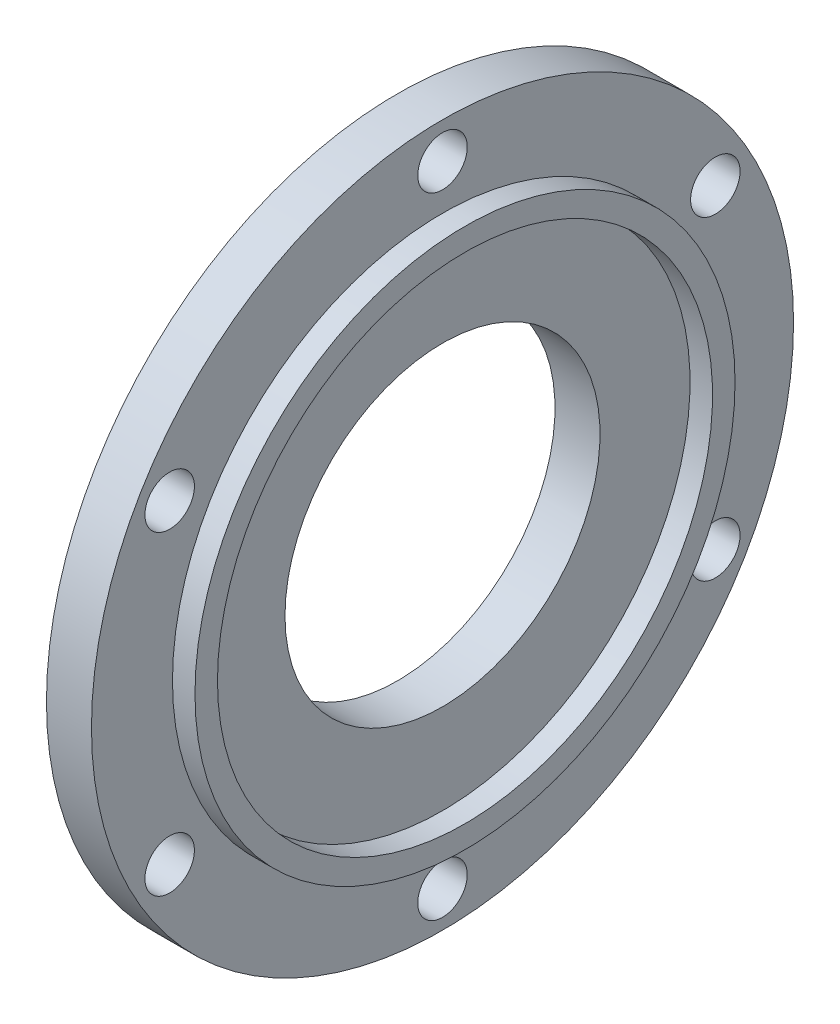
ISO-10303-21;
HEADER;
FILE_DESCRIPTION(('STEP AP214'),'2;1');
FILE_NAME('part.step','',(''),(''),'','','');
FILE_SCHEMA(('AUTOMOTIVE_DESIGN { 1 0 10303 214 1 1 1 1 }'));
ENDSEC;
DATA;
#1=APPLICATION_CONTEXT('core data for automotive mechanical design processes');
#2=APPLICATION_PROTOCOL_DEFINITION('international standard','automotive_design',2000,#1);
#3=PRODUCT_CONTEXT('',#1,'mechanical');
#4=PRODUCT('Part','Part','',(#3));
#5=PRODUCT_RELATED_PRODUCT_CATEGORY('part','',(#4));
#6=PRODUCT_DEFINITION_FORMATION('','',#4);
#7=PRODUCT_DEFINITION_CONTEXT('part definition',#1,'design');
#8=PRODUCT_DEFINITION('design','',#6,#7);
#9=PRODUCT_DEFINITION_SHAPE('','',#8);
#10=(LENGTH_UNIT() NAMED_UNIT(*) SI_UNIT(.MILLI.,.METRE.));
#11=(NAMED_UNIT(*) PLANE_ANGLE_UNIT() SI_UNIT($,.RADIAN.));
#12=(NAMED_UNIT(*) SI_UNIT($,.STERADIAN.) SOLID_ANGLE_UNIT());
#13=UNCERTAINTY_MEASURE_WITH_UNIT(LENGTH_MEASURE(1.E-05),#10,'distance_accuracy_value','');
#14=(GEOMETRIC_REPRESENTATION_CONTEXT(3) GLOBAL_UNCERTAINTY_ASSIGNED_CONTEXT((#13)) GLOBAL_UNIT_ASSIGNED_CONTEXT((#10,
#11,#12)) REPRESENTATION_CONTEXT('',''));
#15=CARTESIAN_POINT('',(0.,0.,0.));
#16=DIRECTION('',(0.,0.,1.));
#17=DIRECTION('',(1.,0.,0.));
#18=AXIS2_PLACEMENT_3D('',#15,#16,#17);
#19=CARTESIAN_POINT('',(0.,0.,0.));
#20=DIRECTION('',(-1.,0.,0.));
#21=DIRECTION('',(0.,0.,1.));
#22=AXIS2_PLACEMENT_3D('',#19,#20,#21);
#23=CYLINDRICAL_SURFACE('',#22,78.);
#24=CARTESIAN_POINT('',(0.,0.,0.));
#25=DIRECTION('',(-1.,0.,0.));
#26=DIRECTION('',(0.,0.,1.));
#27=AXIS2_PLACEMENT_3D('',#24,#25,#26);
#28=CIRCLE('',#27,78.);
#29=CARTESIAN_POINT('',(0.,0.,78.));
#30=VERTEX_POINT('',#29);
#31=EDGE_CURVE('E10',#30,#30,#28,.T.);
#32=ORIENTED_EDGE('',*,*,#31,.F.);
#33=EDGE_LOOP('',(#32));
#34=FACE_BOUND('',#33,.T.);
#35=CARTESIAN_POINT('',(10.,0.,0.));
#36=DIRECTION('',(-1.,0.,0.));
#37=DIRECTION('',(0.,0.,1.));
#38=AXIS2_PLACEMENT_3D('',#35,#36,#37);
#39=CIRCLE('',#38,78.);
#40=CARTESIAN_POINT('',(10.,0.,78.));
#41=VERTEX_POINT('',#40);
#42=EDGE_CURVE('E74',#41,#41,#39,.T.);
#43=ORIENTED_EDGE('',*,*,#42,.T.);
#44=EDGE_LOOP('',(#43));
#45=FACE_BOUND('',#44,.T.);
#46=ADVANCED_FACE('F39',(#34,#45),#23,.T.);
#47=CARTESIAN_POINT('',(0.,78.,0.));
#48=DIRECTION('',(1.,0.,0.));
#49=DIRECTION('',(0.,0.,-1.));
#50=AXIS2_PLACEMENT_3D('',#47,#48,#49);
#51=PLANE('',#50);
#52=CARTESIAN_POINT('',(0.,70.,2.56739074444567E-13));
#53=DIRECTION('',(1.,0.,0.));
#54=DIRECTION('',(0.,0.86602540378444,-0.499999999999998));
#55=AXIS2_PLACEMENT_3D('',#52,#53,#54);
#56=CIRCLE('',#55,5.5);
#57=CARTESIAN_POINT('',(0.,74.7631397208144,-2.74999999999973));
#58=VERTEX_POINT('',#57);
#59=EDGE_CURVE('E83',#58,#58,#56,.T.);
#60=ORIENTED_EDGE('',*,*,#59,.T.);
#61=EDGE_LOOP('',(#60));
#62=FACE_BOUND('',#61,.T.);
#63=CARTESIAN_POINT('',(0.,34.9999999999996,60.6217782649109));
#64=DIRECTION('',(1.,0.,0.));
#65=DIRECTION('',(0.,0.866025403784436,0.500000000000004));
#66=AXIS2_PLACEMENT_3D('',#63,#64,#65);
#67=CIRCLE('',#66,5.5);
#68=CARTESIAN_POINT('',(0.,39.7631397208141,63.371778264911));
#69=VERTEX_POINT('',#68);
#70=EDGE_CURVE('E115',#69,#69,#67,.T.);
#71=ORIENTED_EDGE('',*,*,#70,.T.);
#72=EDGE_LOOP('',(#71));
#73=FACE_BOUND('',#72,.T.);
#74=CARTESIAN_POINT('',(0.,-35.0000000000001,60.6217782649107));
#75=DIRECTION('',(1.,0.,0.));
#76=DIRECTION('',(0.,0.,1.));
#77=AXIS2_PLACEMENT_3D('',#74,#75,#76);
#78=CIRCLE('',#77,5.5);
#79=CARTESIAN_POINT('',(0.,-35.0000000000001,66.1217782649107));
#80=VERTEX_POINT('',#79);
#81=EDGE_CURVE('E107',#80,#80,#78,.T.);
#82=ORIENTED_EDGE('',*,*,#81,.T.);
#83=EDGE_LOOP('',(#82));
#84=FACE_BOUND('',#83,.T.);
#85=CARTESIAN_POINT('',(0.,-70.,-7.45931094670027E-13));
#86=DIRECTION('',(1.,0.,0.));
#87=DIRECTION('',(0.,-0.866025403784443,0.499999999999992));
#88=AXIS2_PLACEMENT_3D('',#85,#86,#87);
#89=CIRCLE('',#88,5.5);
#90=CARTESIAN_POINT('',(0.,-74.7631397208144,2.74999999999921));
#91=VERTEX_POINT('',#90);
#92=EDGE_CURVE('E99',#91,#91,#89,.T.);
#93=ORIENTED_EDGE('',*,*,#92,.T.);
#94=EDGE_LOOP('',(#93));
#95=FACE_BOUND('',#94,.T.);
#96=CARTESIAN_POINT('',(0.,-34.9999999999992,-60.6217782649112));
#97=DIRECTION('',(1.,0.,0.));
#98=DIRECTION('',(0.,-0.866025403784433,-0.50000000000001));
#99=AXIS2_PLACEMENT_3D('',#96,#97,#98);
#100=CIRCLE('',#99,5.5);
#101=CARTESIAN_POINT('',(0.,-39.7631397208136,-63.3717782649112));
#102=VERTEX_POINT('',#101);
#103=EDGE_CURVE('E91',#102,#102,#100,.T.);
#104=ORIENTED_EDGE('',*,*,#103,.T.);
#105=EDGE_LOOP('',(#104));
#106=FACE_BOUND('',#105,.T.);
#107=CARTESIAN_POINT('',(0.,35.0000000000001,-60.6217782649107));
#108=DIRECTION('',(1.,0.,0.));
#109=DIRECTION('',(0.,0.,-1.));
#110=AXIS2_PLACEMENT_3D('',#107,#108,#109);
#111=CIRCLE('',#110,5.5);
#112=CARTESIAN_POINT('',(0.,35.0000000000001,-66.1217782649107));
#113=VERTEX_POINT('',#112);
#114=EDGE_CURVE('E78',#113,#113,#111,.T.);
#115=ORIENTED_EDGE('',*,*,#114,.T.);
#116=EDGE_LOOP('',(#115));
#117=FACE_BOUND('',#116,.T.);
#118=CARTESIAN_POINT('',(0.,0.,0.));
#119=DIRECTION('',(-1.,0.,0.));
#120=DIRECTION('',(0.,0.,1.));
#121=AXIS2_PLACEMENT_3D('',#118,#119,#120);
#122=CIRCLE('',#121,35.);
#123=CARTESIAN_POINT('',(0.,0.,35.));
#124=VERTEX_POINT('',#123);
#125=EDGE_CURVE('E46',#124,#124,#122,.T.);
#126=ORIENTED_EDGE('',*,*,#125,.F.);
#127=EDGE_LOOP('',(#126));
#128=FACE_BOUND('',#127,.T.);
#129=ORIENTED_EDGE('',*,*,#31,.T.);
#130=EDGE_LOOP('',(#129));
#131=FACE_BOUND('',#130,.T.);
#132=ADVANCED_FACE('F127',(#62,#73,#84,#95,#106,#117,#128,#131),#51,.F.);
#133=CARTESIAN_POINT('',(0.,0.,0.));
#134=DIRECTION('',(-1.,0.,0.));
#135=DIRECTION('',(0.,0.,1.));
#136=AXIS2_PLACEMENT_3D('',#133,#134,#135);
#137=CYLINDRICAL_SURFACE('',#136,35.);
#138=CARTESIAN_POINT('',(10.,0.,0.));
#139=DIRECTION('',(-1.,0.,0.));
#140=DIRECTION('',(0.,0.,1.));
#141=AXIS2_PLACEMENT_3D('',#138,#139,#140);
#142=CIRCLE('',#141,35.);
#143=CARTESIAN_POINT('',(10.,0.,35.));
#144=VERTEX_POINT('',#143);
#145=EDGE_CURVE('E51',#144,#144,#142,.T.);
#146=ORIENTED_EDGE('',*,*,#145,.F.);
#147=EDGE_LOOP('',(#146));
#148=FACE_BOUND('',#147,.T.);
#149=ORIENTED_EDGE('',*,*,#125,.T.);
#150=EDGE_LOOP('',(#149));
#151=FACE_BOUND('',#150,.T.);
#152=ADVANCED_FACE('F177',(#148,#151),#137,.F.);
#153=CARTESIAN_POINT('',(10.,35.,0.));
#154=DIRECTION('',(-1.,0.,0.));
#155=DIRECTION('',(0.,0.,1.));
#156=AXIS2_PLACEMENT_3D('',#153,#154,#155);
#157=PLANE('',#156);
#158=CARTESIAN_POINT('',(10.,0.,0.));
#159=DIRECTION('',(-1.,0.,0.));
#160=DIRECTION('',(0.,0.,1.));
#161=AXIS2_PLACEMENT_3D('',#158,#159,#160);
#162=CIRCLE('',#161,55.);
#163=CARTESIAN_POINT('',(10.,0.,55.));
#164=VERTEX_POINT('',#163);
#165=EDGE_CURVE('E56',#164,#164,#162,.T.);
#166=ORIENTED_EDGE('',*,*,#165,.F.);
#167=EDGE_LOOP('',(#166));
#168=FACE_BOUND('',#167,.T.);
#169=ORIENTED_EDGE('',*,*,#145,.T.);
#170=EDGE_LOOP('',(#169));
#171=FACE_BOUND('',#170,.T.);
#172=ADVANCED_FACE('F171',(#168,#171),#157,.F.);
#173=CARTESIAN_POINT('',(0.,0.,0.));
#174=DIRECTION('',(-1.,0.,0.));
#175=DIRECTION('',(0.,0.,1.));
#176=AXIS2_PLACEMENT_3D('',#173,#174,#175);
#177=CYLINDRICAL_SURFACE('',#176,55.);
#178=CARTESIAN_POINT('',(15.,0.,0.));
#179=DIRECTION('',(-1.,0.,0.));
#180=DIRECTION('',(0.,0.,1.));
#181=AXIS2_PLACEMENT_3D('',#178,#179,#180);
#182=CIRCLE('',#181,55.);
#183=CARTESIAN_POINT('',(15.,0.,55.));
#184=VERTEX_POINT('',#183);
#185=EDGE_CURVE('E62',#184,#184,#182,.T.);
#186=ORIENTED_EDGE('',*,*,#185,.F.);
#187=EDGE_LOOP('',(#186));
#188=FACE_BOUND('',#187,.T.);
#189=ORIENTED_EDGE('',*,*,#165,.T.);
#190=EDGE_LOOP('',(#189));
#191=FACE_BOUND('',#190,.T.);
#192=ADVANCED_FACE('F165',(#188,#191),#177,.F.);
#193=CARTESIAN_POINT('',(15.,55.,0.));
#194=DIRECTION('',(-1.,0.,0.));
#195=DIRECTION('',(0.,0.,1.));
#196=AXIS2_PLACEMENT_3D('',#193,#194,#195);
#197=PLANE('',#196);
#198=CARTESIAN_POINT('',(15.,0.,0.));
#199=DIRECTION('',(-1.,0.,0.));
#200=DIRECTION('',(0.,0.,1.));
#201=AXIS2_PLACEMENT_3D('',#198,#199,#200);
#202=CIRCLE('',#201,60.);
#203=CARTESIAN_POINT('',(15.,0.,60.));
#204=VERTEX_POINT('',#203);
#205=EDGE_CURVE('E66',#204,#204,#202,.T.);
#206=ORIENTED_EDGE('',*,*,#205,.F.);
#207=EDGE_LOOP('',(#206));
#208=FACE_BOUND('',#207,.T.);
#209=ORIENTED_EDGE('',*,*,#185,.T.);
#210=EDGE_LOOP('',(#209));
#211=FACE_BOUND('',#210,.T.);
#212=ADVANCED_FACE('F159',(#208,#211),#197,.F.);
#213=CARTESIAN_POINT('',(0.,0.,0.));
#214=DIRECTION('',(-1.,0.,0.));
#215=DIRECTION('',(0.,0.,1.));
#216=AXIS2_PLACEMENT_3D('',#213,#214,#215);
#217=CYLINDRICAL_SURFACE('',#216,60.);
#218=CARTESIAN_POINT('',(10.,0.,0.));
#219=DIRECTION('',(-1.,0.,0.));
#220=DIRECTION('',(0.,0.,1.));
#221=AXIS2_PLACEMENT_3D('',#218,#219,#220);
#222=CIRCLE('',#221,60.);
#223=CARTESIAN_POINT('',(10.,0.,60.));
#224=VERTEX_POINT('',#223);
#225=EDGE_CURVE('E70',#224,#224,#222,.T.);
#226=ORIENTED_EDGE('',*,*,#225,.F.);
#227=EDGE_LOOP('',(#226));
#228=FACE_BOUND('',#227,.T.);
#229=ORIENTED_EDGE('',*,*,#205,.T.);
#230=EDGE_LOOP('',(#229));
#231=FACE_BOUND('',#230,.T.);
#232=ADVANCED_FACE('F141',(#228,#231),#217,.T.);
#233=CARTESIAN_POINT('',(10.,60.,0.));
#234=DIRECTION('',(-1.,0.,0.));
#235=DIRECTION('',(0.,0.,1.));
#236=AXIS2_PLACEMENT_3D('',#233,#234,#235);
#237=PLANE('',#236);
#238=CARTESIAN_POINT('',(10.,70.,2.56739074444567E-13));
#239=DIRECTION('',(1.,0.,0.));
#240=DIRECTION('',(0.,0.86602540378444,-0.499999999999998));
#241=AXIS2_PLACEMENT_3D('',#238,#239,#240);
#242=CIRCLE('',#241,5.5);
#243=CARTESIAN_POINT('',(10.,74.7631397208144,-2.74999999999973));
#244=VERTEX_POINT('',#243);
#245=EDGE_CURVE('E119',#244,#244,#242,.T.);
#246=ORIENTED_EDGE('',*,*,#245,.F.);
#247=EDGE_LOOP('',(#246));
#248=FACE_BOUND('',#247,.T.);
#249=CARTESIAN_POINT('',(10.,34.9999999999996,60.6217782649109));
#250=DIRECTION('',(1.,0.,0.));
#251=DIRECTION('',(0.,0.866025403784436,0.500000000000004));
#252=AXIS2_PLACEMENT_3D('',#249,#250,#251);
#253=CIRCLE('',#252,5.5);
#254=CARTESIAN_POINT('',(10.,39.7631397208141,63.371778264911));
#255=VERTEX_POINT('',#254);
#256=EDGE_CURVE('E111',#255,#255,#253,.T.);
#257=ORIENTED_EDGE('',*,*,#256,.F.);
#258=EDGE_LOOP('',(#257));
#259=FACE_BOUND('',#258,.T.);
#260=CARTESIAN_POINT('',(10.,-35.0000000000001,60.6217782649107));
#261=DIRECTION('',(1.,0.,0.));
#262=DIRECTION('',(0.,0.,1.));
#263=AXIS2_PLACEMENT_3D('',#260,#261,#262);
#264=CIRCLE('',#263,5.5);
#265=CARTESIAN_POINT('',(10.,-35.0000000000001,66.1217782649107));
#266=VERTEX_POINT('',#265);
#267=EDGE_CURVE('E103',#266,#266,#264,.T.);
#268=ORIENTED_EDGE('',*,*,#267,.F.);
#269=EDGE_LOOP('',(#268));
#270=FACE_BOUND('',#269,.T.);
#271=CARTESIAN_POINT('',(10.,-70.,-7.45931094670027E-13));
#272=DIRECTION('',(1.,0.,0.));
#273=DIRECTION('',(0.,-0.866025403784443,0.499999999999992));
#274=AXIS2_PLACEMENT_3D('',#271,#272,#273);
#275=CIRCLE('',#274,5.5);
#276=CARTESIAN_POINT('',(10.,-74.7631397208144,2.74999999999921));
#277=VERTEX_POINT('',#276);
#278=EDGE_CURVE('E95',#277,#277,#275,.T.);
#279=ORIENTED_EDGE('',*,*,#278,.F.);
#280=EDGE_LOOP('',(#279));
#281=FACE_BOUND('',#280,.T.);
#282=CARTESIAN_POINT('',(10.,-34.9999999999992,-60.6217782649112));
#283=DIRECTION('',(1.,0.,0.));
#284=DIRECTION('',(0.,-0.866025403784433,-0.50000000000001));
#285=AXIS2_PLACEMENT_3D('',#282,#283,#284);
#286=CIRCLE('',#285,5.5);
#287=CARTESIAN_POINT('',(10.,-39.7631397208136,-63.3717782649112));
#288=VERTEX_POINT('',#287);
#289=EDGE_CURVE('E87',#288,#288,#286,.T.);
#290=ORIENTED_EDGE('',*,*,#289,.F.);
#291=EDGE_LOOP('',(#290));
#292=FACE_BOUND('',#291,.T.);
#293=CARTESIAN_POINT('',(10.,35.0000000000001,-60.6217782649107));
#294=DIRECTION('',(1.,0.,0.));
#295=DIRECTION('',(0.,0.,-1.));
#296=AXIS2_PLACEMENT_3D('',#293,#294,#295);
#297=CIRCLE('',#296,5.5);
#298=CARTESIAN_POINT('',(10.,35.0000000000001,-66.1217782649107));
#299=VERTEX_POINT('',#298);
#300=EDGE_CURVE('E79',#299,#299,#297,.T.);
#301=ORIENTED_EDGE('',*,*,#300,.F.);
#302=EDGE_LOOP('',(#301));
#303=FACE_BOUND('',#302,.T.);
#304=ORIENTED_EDGE('',*,*,#42,.F.);
#305=EDGE_LOOP('',(#304));
#306=FACE_BOUND('',#305,.T.);
#307=ORIENTED_EDGE('',*,*,#225,.T.);
#308=EDGE_LOOP('',(#307));
#309=FACE_BOUND('',#308,.T.);
#310=ADVANCED_FACE('F137',(#248,#259,#270,#281,#292,#303,#306,#309),#237,.F.);
#311=CARTESIAN_POINT('',(0.,35.0000000000001,-60.6217782649107));
#312=DIRECTION('',(1.,0.,0.));
#313=DIRECTION('',(0.,0.,-1.));
#314=AXIS2_PLACEMENT_3D('',#311,#312,#313);
#315=CYLINDRICAL_SURFACE('',#314,5.5);
#316=ORIENTED_EDGE('',*,*,#114,.F.);
#317=EDGE_LOOP('',(#316));
#318=FACE_BOUND('',#317,.T.);
#319=ORIENTED_EDGE('',*,*,#300,.T.);
#320=EDGE_LOOP('',(#319));
#321=FACE_BOUND('',#320,.T.);
#322=ADVANCED_FACE('F140',(#318,#321),#315,.F.);
#323=CARTESIAN_POINT('',(0.,-34.9999999999992,-60.6217782649112));
#324=DIRECTION('',(1.,0.,0.));
#325=DIRECTION('',(0.,0.,-1.));
#326=AXIS2_PLACEMENT_3D('',#323,#324,#325);
#327=CYLINDRICAL_SURFACE('',#326,5.5);
#328=ORIENTED_EDGE('',*,*,#103,.F.);
#329=EDGE_LOOP('',(#328));
#330=FACE_BOUND('',#329,.T.);
#331=ORIENTED_EDGE('',*,*,#289,.T.);
#332=EDGE_LOOP('',(#331));
#333=FACE_BOUND('',#332,.T.);
#334=ADVANCED_FACE('F213',(#330,#333),#327,.F.);
#335=CARTESIAN_POINT('',(0.,-70.,-7.45931094670027E-13));
#336=DIRECTION('',(1.,0.,0.));
#337=DIRECTION('',(0.,0.,-1.));
#338=AXIS2_PLACEMENT_3D('',#335,#336,#337);
#339=CYLINDRICAL_SURFACE('',#338,5.5);
#340=ORIENTED_EDGE('',*,*,#92,.F.);
#341=EDGE_LOOP('',(#340));
#342=FACE_BOUND('',#341,.T.);
#343=ORIENTED_EDGE('',*,*,#278,.T.);
#344=EDGE_LOOP('',(#343));
#345=FACE_BOUND('',#344,.T.);
#346=ADVANCED_FACE('F218',(#342,#345),#339,.F.);
#347=CARTESIAN_POINT('',(0.,-35.0000000000001,60.6217782649107));
#348=DIRECTION('',(1.,0.,0.));
#349=DIRECTION('',(0.,0.,-1.));
#350=AXIS2_PLACEMENT_3D('',#347,#348,#349);
#351=CYLINDRICAL_SURFACE('',#350,5.5);
#352=ORIENTED_EDGE('',*,*,#81,.F.);
#353=EDGE_LOOP('',(#352));
#354=FACE_BOUND('',#353,.T.);
#355=ORIENTED_EDGE('',*,*,#267,.T.);
#356=EDGE_LOOP('',(#355));
#357=FACE_BOUND('',#356,.T.);
#358=ADVANCED_FACE('F228',(#354,#357),#351,.F.);
#359=CARTESIAN_POINT('',(0.,34.9999999999996,60.6217782649109));
#360=DIRECTION('',(1.,0.,0.));
#361=DIRECTION('',(0.,0.,-1.));
#362=AXIS2_PLACEMENT_3D('',#359,#360,#361);
#363=CYLINDRICAL_SURFACE('',#362,5.5);
#364=ORIENTED_EDGE('',*,*,#70,.F.);
#365=EDGE_LOOP('',(#364));
#366=FACE_BOUND('',#365,.T.);
#367=ORIENTED_EDGE('',*,*,#256,.T.);
#368=EDGE_LOOP('',(#367));
#369=FACE_BOUND('',#368,.T.);
#370=ADVANCED_FACE('F133',(#366,#369),#363,.F.);
#371=CARTESIAN_POINT('',(0.,70.,2.56739074444567E-13));
#372=DIRECTION('',(1.,0.,0.));
#373=DIRECTION('',(0.,0.,-1.));
#374=AXIS2_PLACEMENT_3D('',#371,#372,#373);
#375=CYLINDRICAL_SURFACE('',#374,5.5);
#376=ORIENTED_EDGE('',*,*,#59,.F.);
#377=EDGE_LOOP('',(#376));
#378=FACE_BOUND('',#377,.T.);
#379=ORIENTED_EDGE('',*,*,#245,.T.);
#380=EDGE_LOOP('',(#379));
#381=FACE_BOUND('',#380,.T.);
#382=ADVANCED_FACE('F130',(#378,#381),#375,.F.);
#383=CLOSED_SHELL('',(#46,#132,#152,#172,#192,#212,#232,#310,#322,#334,#346,#358,#370,#382));
#384=MANIFOLD_SOLID_BREP('B2',#383);
#385=ADVANCED_BREP_SHAPE_REPRESENTATION('',(#18,#384),#14);
#386=SHAPE_DEFINITION_REPRESENTATION(#9,#385);
ENDSEC;
END-ISO-10303-21;
